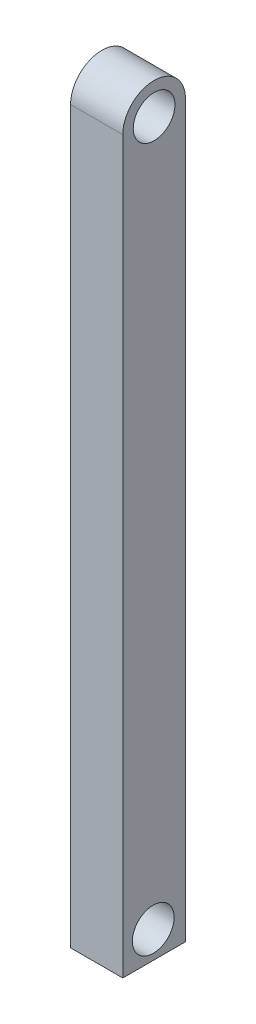
ISO-10303-21;
HEADER;
FILE_DESCRIPTION(('STEP AP214'),'2;1');
FILE_NAME('part.step','',(''),(''),'','','');
FILE_SCHEMA(('AUTOMOTIVE_DESIGN { 1 0 10303 214 1 1 1 1 }'));
ENDSEC;
DATA;
#1=APPLICATION_CONTEXT('core data for automotive mechanical design processes');
#2=APPLICATION_PROTOCOL_DEFINITION('international standard','automotive_design',2000,#1);
#3=PRODUCT_CONTEXT('',#1,'mechanical');
#4=PRODUCT('Part','Part','',(#3));
#5=PRODUCT_RELATED_PRODUCT_CATEGORY('part','',(#4));
#6=PRODUCT_DEFINITION_FORMATION('','',#4);
#7=PRODUCT_DEFINITION_CONTEXT('part definition',#1,'design');
#8=PRODUCT_DEFINITION('design','',#6,#7);
#9=PRODUCT_DEFINITION_SHAPE('','',#8);
#10=(LENGTH_UNIT() NAMED_UNIT(*) SI_UNIT(.MILLI.,.METRE.));
#11=(NAMED_UNIT(*) PLANE_ANGLE_UNIT() SI_UNIT($,.RADIAN.));
#12=(NAMED_UNIT(*) SI_UNIT($,.STERADIAN.) SOLID_ANGLE_UNIT());
#13=UNCERTAINTY_MEASURE_WITH_UNIT(LENGTH_MEASURE(1.E-05),#10,'distance_accuracy_value','');
#14=(GEOMETRIC_REPRESENTATION_CONTEXT(3) GLOBAL_UNCERTAINTY_ASSIGNED_CONTEXT((#13)) GLOBAL_UNIT_ASSIGNED_CONTEXT((#10,
#11,#12)) REPRESENTATION_CONTEXT('',''));
#15=CARTESIAN_POINT('',(0.,0.,0.));
#16=DIRECTION('',(0.,0.,1.));
#17=DIRECTION('',(1.,0.,0.));
#18=AXIS2_PLACEMENT_3D('',#15,#16,#17);
#19=CARTESIAN_POINT('',(-8.50778780138378,72.4285297549592,3.));
#20=DIRECTION('',(1.,0.,0.));
#21=DIRECTION('',(0.,1.,0.));
#22=AXIS2_PLACEMENT_3D('',#19,#20,#21);
#23=PLANE('',#22);
#24=CARTESIAN_POINT('',(-8.50778780138377,36.7220601734602,1.54112090071284));
#25=DIRECTION('',(1.,0.,0.));
#26=DIRECTION('',(0.,1.,0.));
#27=AXIS2_PLACEMENT_3D('',#24,#25,#26);
#28=CIRCLE('',#27,1.);
#29=CARTESIAN_POINT('',(-8.50778780138377,37.7220601734602,1.54112090071284));
#30=VERTEX_POINT('',#29);
#31=EDGE_CURVE('E109',#30,#30,#28,.T.);
#32=ORIENTED_EDGE('',*,*,#31,.T.);
#33=EDGE_LOOP('',(#32));
#34=FACE_BOUND('',#33,.T.);
#35=CARTESIAN_POINT('',(-8.50778780138378,70.4020531199645,1.5));
#36=DIRECTION('',(1.,0.,0.));
#37=DIRECTION('',(0.,1.,0.));
#38=AXIS2_PLACEMENT_3D('',#35,#36,#37);
#39=CIRCLE('',#38,1.);
#40=CARTESIAN_POINT('',(-8.50778780138378,71.4020531199645,1.5));
#41=VERTEX_POINT('',#40);
#42=EDGE_CURVE('E94',#41,#41,#39,.F.);
#43=ORIENTED_EDGE('',*,*,#42,.F.);
#44=EDGE_LOOP('',(#43));
#45=FACE_BOUND('',#44,.T.);
#46=DIRECTION('',(0.,-1.,0.));
#47=VECTOR('',#46,1.);
#48=CARTESIAN_POINT('',(-8.50778780138378,72.4285297549592,3.));
#49=LINE('',#48,#47);
#50=CARTESIAN_POINT('',(-8.50778780138378,70.4020531199645,3.));
#51=VERTEX_POINT('',#50);
#52=CARTESIAN_POINT('',(-8.50778780138377,35.4285297549592,3.));
#53=VERTEX_POINT('',#52);
#54=EDGE_CURVE('E89',#51,#53,#49,.T.);
#55=ORIENTED_EDGE('',*,*,#54,.F.);
#56=CARTESIAN_POINT('',(-8.50778780138378,70.4020531199645,1.5));
#57=DIRECTION('',(1.,0.,0.));
#58=DIRECTION('',(0.,1.,0.));
#59=AXIS2_PLACEMENT_3D('',#56,#57,#58);
#60=CIRCLE('',#59,1.5);
#61=CARTESIAN_POINT('',(-8.50778780138378,70.4020531199645,0.));
#62=VERTEX_POINT('',#61);
#63=EDGE_CURVE('E106',#62,#51,#60,.T.);
#64=ORIENTED_EDGE('',*,*,#63,.F.);
#65=DIRECTION('',(0.,-1.,0.));
#66=VECTOR('',#65,1.);
#67=CARTESIAN_POINT('',(-8.50778780138378,72.4285297549592,0.));
#68=LINE('',#67,#66);
#69=CARTESIAN_POINT('',(-8.50778780138377,35.4285297549592,0.));
#70=VERTEX_POINT('',#69);
#71=EDGE_CURVE('E81',#62,#70,#68,.T.);
#72=ORIENTED_EDGE('',*,*,#71,.T.);
#73=DIRECTION('',(0.,0.,-1.));
#74=VECTOR('',#73,1.);
#75=CARTESIAN_POINT('',(-8.50778780138377,35.4285297549592,3.));
#76=LINE('',#75,#74);
#77=EDGE_CURVE('E11',#53,#70,#76,.T.);
#78=ORIENTED_EDGE('',*,*,#77,.F.);
#79=EDGE_LOOP('',(#55,#64,#72,#78));
#80=FACE_BOUND('',#79,.T.);
#81=ADVANCED_FACE('F37',(#34,#45,#80),#23,.F.);
#82=CARTESIAN_POINT('',(-6.00778780138377,35.4285297549592,3.));
#83=DIRECTION('',(0.,1.,0.));
#84=DIRECTION('',(0.,0.,1.));
#85=AXIS2_PLACEMENT_3D('',#82,#83,#84);
#86=PLANE('',#85);
#87=DIRECTION('',(1.,0.,0.));
#88=VECTOR('',#87,1.);
#89=CARTESIAN_POINT('',(-6.00778780138377,35.4285297549592,0.));
#90=LINE('',#89,#88);
#91=CARTESIAN_POINT('',(-6.00778780138377,35.4285297549592,0.));
#92=VERTEX_POINT('',#91);
#93=EDGE_CURVE('E72',#70,#92,#90,.T.);
#94=ORIENTED_EDGE('',*,*,#93,.T.);
#95=DIRECTION('',(0.,0.,-1.));
#96=VECTOR('',#95,1.);
#97=CARTESIAN_POINT('',(-6.00778780138377,35.4285297549592,3.));
#98=LINE('',#97,#96);
#99=CARTESIAN_POINT('',(-6.00778780138377,35.4285297549592,3.));
#100=VERTEX_POINT('',#99);
#101=EDGE_CURVE('E44',#100,#92,#98,.T.);
#102=ORIENTED_EDGE('',*,*,#101,.F.);
#103=DIRECTION('',(1.,0.,0.));
#104=VECTOR('',#103,1.);
#105=CARTESIAN_POINT('',(-6.00778780138377,35.4285297549592,3.));
#106=LINE('',#105,#104);
#107=EDGE_CURVE('E60',#53,#100,#106,.T.);
#108=ORIENTED_EDGE('',*,*,#107,.F.);
#109=ORIENTED_EDGE('',*,*,#77,.T.);
#110=EDGE_LOOP('',(#94,#102,#108,#109));
#111=FACE_BOUND('',#110,.T.);
#112=ADVANCED_FACE('F74',(#111),#86,.F.);
#113=CARTESIAN_POINT('',(-6.00778780138378,72.4285297549592,3.));
#114=DIRECTION('',(-1.,0.,0.));
#115=DIRECTION('',(0.,-1.,0.));
#116=AXIS2_PLACEMENT_3D('',#113,#114,#115);
#117=PLANE('',#116);
#118=CARTESIAN_POINT('',(-6.00778780138377,36.7220601734602,1.54112090071284));
#119=DIRECTION('',(1.,0.,0.));
#120=DIRECTION('',(0.,1.,0.));
#121=AXIS2_PLACEMENT_3D('',#118,#119,#120);
#122=CIRCLE('',#121,1.);
#123=CARTESIAN_POINT('',(-6.00778780138377,37.7220601734602,1.54112090071284));
#124=VERTEX_POINT('',#123);
#125=EDGE_CURVE('E112',#124,#124,#122,.T.);
#126=ORIENTED_EDGE('',*,*,#125,.F.);
#127=EDGE_LOOP('',(#126));
#128=FACE_BOUND('',#127,.T.);
#129=CARTESIAN_POINT('',(-6.00778780138378,70.4020531199645,1.5));
#130=DIRECTION('',(1.,0.,0.));
#131=DIRECTION('',(0.,1.,0.));
#132=AXIS2_PLACEMENT_3D('',#129,#130,#131);
#133=CIRCLE('',#132,1.);
#134=CARTESIAN_POINT('',(-6.00778780138378,71.4020531199645,1.5));
#135=VERTEX_POINT('',#134);
#136=EDGE_CURVE('E99',#135,#135,#133,.T.);
#137=ORIENTED_EDGE('',*,*,#136,.F.);
#138=EDGE_LOOP('',(#137));
#139=FACE_BOUND('',#138,.T.);
#140=DIRECTION('',(0.,1.,0.));
#141=VECTOR('',#140,1.);
#142=CARTESIAN_POINT('',(-6.00778780138378,72.4285297549592,0.));
#143=LINE('',#142,#141);
#144=CARTESIAN_POINT('',(-6.00778780138378,70.4020531199645,0.));
#145=VERTEX_POINT('',#144);
#146=EDGE_CURVE('E80',#92,#145,#143,.T.);
#147=ORIENTED_EDGE('',*,*,#146,.T.);
#148=CARTESIAN_POINT('',(-6.00778780138378,70.4020531199645,1.5));
#149=DIRECTION('',(-1.,0.,0.));
#150=DIRECTION('',(0.,-1.,0.));
#151=AXIS2_PLACEMENT_3D('',#148,#149,#150);
#152=CIRCLE('',#151,1.5);
#153=CARTESIAN_POINT('',(-6.00778780138378,70.4020531199645,3.));
#154=VERTEX_POINT('',#153);
#155=EDGE_CURVE('E51',#154,#145,#152,.T.);
#156=ORIENTED_EDGE('',*,*,#155,.F.);
#157=DIRECTION('',(0.,1.,0.));
#158=VECTOR('',#157,1.);
#159=CARTESIAN_POINT('',(-6.00778780138378,72.4285297549592,3.));
#160=LINE('',#159,#158);
#161=EDGE_CURVE('E86',#100,#154,#160,.T.);
#162=ORIENTED_EDGE('',*,*,#161,.F.);
#163=ORIENTED_EDGE('',*,*,#101,.T.);
#164=EDGE_LOOP('',(#147,#156,#162,#163));
#165=FACE_BOUND('',#164,.T.);
#166=ADVANCED_FACE('F85',(#128,#139,#165),#117,.F.);
#167=CARTESIAN_POINT('',(0.,0.,3.));
#168=DIRECTION('',(0.,0.,-1.));
#169=DIRECTION('',(-1.,0.,0.));
#170=AXIS2_PLACEMENT_3D('',#167,#168,#169);
#171=PLANE('',#170);
#172=ORIENTED_EDGE('',*,*,#161,.T.);
#173=DIRECTION('',(1.,0.,0.));
#174=VECTOR('',#173,1.);
#175=CARTESIAN_POINT('',(-8.50878780138379,70.4020531199645,3.));
#176=LINE('',#175,#174);
#177=EDGE_CURVE('E102',#51,#154,#176,.T.);
#178=ORIENTED_EDGE('',*,*,#177,.F.);
#179=ORIENTED_EDGE('',*,*,#54,.T.);
#180=ORIENTED_EDGE('',*,*,#107,.T.);
#181=EDGE_LOOP('',(#172,#178,#179,#180));
#182=FACE_BOUND('',#181,.T.);
#183=ADVANCED_FACE('F121',(#182),#171,.F.);
#184=CARTESIAN_POINT('',(0.,0.,0.));
#185=DIRECTION('',(0.,0.,-1.));
#186=DIRECTION('',(-1.,0.,0.));
#187=AXIS2_PLACEMENT_3D('',#184,#185,#186);
#188=PLANE('',#187);
#189=DIRECTION('',(1.,0.,0.));
#190=VECTOR('',#189,1.);
#191=CARTESIAN_POINT('',(-8.50878780138379,70.4020531199645,0.));
#192=LINE('',#191,#190);
#193=EDGE_CURVE('E88',#62,#145,#192,.T.);
#194=ORIENTED_EDGE('',*,*,#193,.T.);
#195=ORIENTED_EDGE('',*,*,#146,.F.);
#196=ORIENTED_EDGE('',*,*,#93,.F.);
#197=ORIENTED_EDGE('',*,*,#71,.F.);
#198=EDGE_LOOP('',(#194,#195,#196,#197));
#199=FACE_BOUND('',#198,.T.);
#200=ADVANCED_FACE('F87',(#199),#188,.T.);
#201=CARTESIAN_POINT('',(-8.50878780138379,70.4020531199645,1.5));
#202=DIRECTION('',(1.,0.,0.));
#203=DIRECTION('',(0.,1.,0.));
#204=AXIS2_PLACEMENT_3D('',#201,#202,#203);
#205=CYLINDRICAL_SURFACE('',#204,1.5);
#206=ORIENTED_EDGE('',*,*,#63,.T.);
#207=ORIENTED_EDGE('',*,*,#177,.T.);
#208=ORIENTED_EDGE('',*,*,#155,.T.);
#209=ORIENTED_EDGE('',*,*,#193,.F.);
#210=EDGE_LOOP('',(#206,#207,#208,#209));
#211=FACE_BOUND('',#210,.T.);
#212=ADVANCED_FACE('F128',(#211),#205,.T.);
#213=CARTESIAN_POINT('',(-8.50878780138379,70.4020531199645,1.5));
#214=DIRECTION('',(1.,0.,0.));
#215=DIRECTION('',(0.,1.,0.));
#216=AXIS2_PLACEMENT_3D('',#213,#214,#215);
#217=CYLINDRICAL_SURFACE('',#216,1.);
#218=ORIENTED_EDGE('',*,*,#136,.T.);
#219=EDGE_LOOP('',(#218));
#220=FACE_BOUND('',#219,.T.);
#221=ORIENTED_EDGE('',*,*,#42,.T.);
#222=EDGE_LOOP('',(#221));
#223=FACE_BOUND('',#222,.T.);
#224=ADVANCED_FACE('F125',(#220,#223),#217,.F.);
#225=CARTESIAN_POINT('',(-16.0077878013838,36.7220601734602,1.54112090071284));
#226=DIRECTION('',(1.,0.,0.));
#227=DIRECTION('',(0.,1.,0.));
#228=AXIS2_PLACEMENT_3D('',#225,#226,#227);
#229=CYLINDRICAL_SURFACE('',#228,1.);
#230=ORIENTED_EDGE('',*,*,#125,.T.);
#231=EDGE_LOOP('',(#230));
#232=FACE_BOUND('',#231,.T.);
#233=ORIENTED_EDGE('',*,*,#31,.F.);
#234=EDGE_LOOP('',(#233));
#235=FACE_BOUND('',#234,.T.);
#236=ADVANCED_FACE('F116',(#232,#235),#229,.F.);
#237=CLOSED_SHELL('',(#81,#112,#166,#183,#200,#212,#224,#236));
#238=MANIFOLD_SOLID_BREP('B2',#237);
#239=ADVANCED_BREP_SHAPE_REPRESENTATION('',(#18,#238),#14);
#240=SHAPE_DEFINITION_REPRESENTATION(#9,#239);
ENDSEC;
END-ISO-10303-21;
